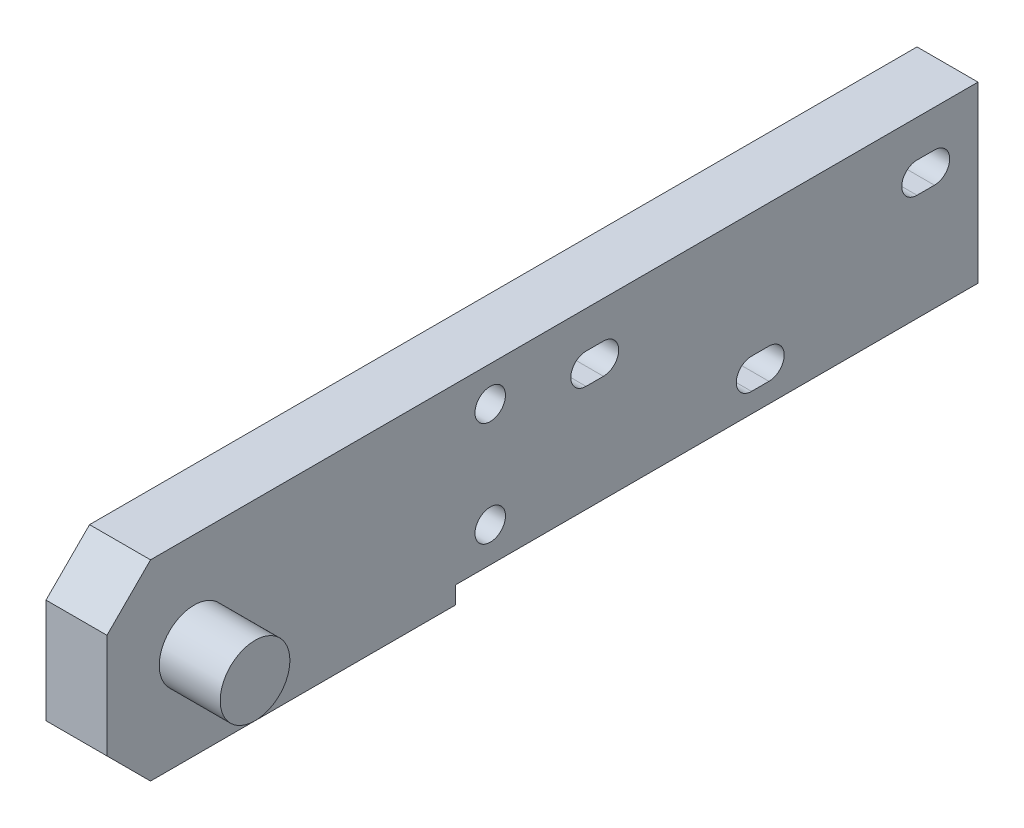
ISO-10303-21;
HEADER;
FILE_DESCRIPTION(('STEP AP214'),'2;1');
FILE_NAME('part.step','',(''),(''),'','','');
FILE_SCHEMA(('AUTOMOTIVE_DESIGN { 1 0 10303 214 1 1 1 1 }'));
ENDSEC;
DATA;
#1=APPLICATION_CONTEXT('core data for automotive mechanical design processes');
#2=APPLICATION_PROTOCOL_DEFINITION('international standard','automotive_design',2000,#1);
#3=PRODUCT_CONTEXT('',#1,'mechanical');
#4=PRODUCT('Part','Part','',(#3));
#5=PRODUCT_RELATED_PRODUCT_CATEGORY('part','',(#4));
#6=PRODUCT_DEFINITION_FORMATION('','',#4);
#7=PRODUCT_DEFINITION_CONTEXT('part definition',#1,'design');
#8=PRODUCT_DEFINITION('design','',#6,#7);
#9=PRODUCT_DEFINITION_SHAPE('','',#8);
#10=(LENGTH_UNIT() NAMED_UNIT(*) SI_UNIT(.MILLI.,.METRE.));
#11=(NAMED_UNIT(*) PLANE_ANGLE_UNIT() SI_UNIT($,.RADIAN.));
#12=(NAMED_UNIT(*) SI_UNIT($,.STERADIAN.) SOLID_ANGLE_UNIT());
#13=UNCERTAINTY_MEASURE_WITH_UNIT(LENGTH_MEASURE(1.E-05),#10,'distance_accuracy_value','');
#14=(GEOMETRIC_REPRESENTATION_CONTEXT(3) GLOBAL_UNCERTAINTY_ASSIGNED_CONTEXT((#13)) GLOBAL_UNIT_ASSIGNED_CONTEXT((#10,
#11,#12)) REPRESENTATION_CONTEXT('',''));
#15=CARTESIAN_POINT('',(0.,0.,0.));
#16=DIRECTION('',(0.,0.,1.));
#17=DIRECTION('',(1.,0.,0.));
#18=AXIS2_PLACEMENT_3D('',#15,#16,#17);
#19=CARTESIAN_POINT('',(7.,0.,10.));
#20=DIRECTION('',(0.,0.,-1.));
#21=DIRECTION('',(0.,1.,0.));
#22=AXIS2_PLACEMENT_3D('',#19,#20,#21);
#23=PLANE('',#22);
#24=DIRECTION('',(0.,-1.,0.));
#25=VECTOR('',#24,1.);
#26=CARTESIAN_POINT('',(0.,0.,10.));
#27=LINE('',#26,#25);
#28=CARTESIAN_POINT('',(0.,6.,10.));
#29=VERTEX_POINT('',#28);
#30=CARTESIAN_POINT('',(0.,-6.,10.));
#31=VERTEX_POINT('',#30);
#32=EDGE_CURVE('E253',#29,#31,#27,.T.);
#33=ORIENTED_EDGE('',*,*,#32,.T.);
#34=DIRECTION('',(-1.,0.,0.));
#35=VECTOR('',#34,1.);
#36=CARTESIAN_POINT('',(7.,-6.,10.));
#37=LINE('',#36,#35);
#38=CARTESIAN_POINT('',(7.,-6.,10.));
#39=VERTEX_POINT('',#38);
#40=EDGE_CURVE('E11',#39,#31,#37,.T.);
#41=ORIENTED_EDGE('',*,*,#40,.F.);
#42=DIRECTION('',(0.,-1.,0.));
#43=VECTOR('',#42,1.);
#44=CARTESIAN_POINT('',(7.,0.,10.));
#45=LINE('',#44,#43);
#46=CARTESIAN_POINT('',(7.,6.,10.));
#47=VERTEX_POINT('',#46);
#48=EDGE_CURVE('E353',#47,#39,#45,.T.);
#49=ORIENTED_EDGE('',*,*,#48,.F.);
#50=DIRECTION('',(-1.,0.,0.));
#51=VECTOR('',#50,1.);
#52=CARTESIAN_POINT('',(7.,6.,10.));
#53=LINE('',#52,#51);
#54=EDGE_CURVE('E271',#47,#29,#53,.T.);
#55=ORIENTED_EDGE('',*,*,#54,.T.);
#56=EDGE_LOOP('',(#33,#41,#49,#55));
#57=FACE_BOUND('',#56,.T.);
#58=ADVANCED_FACE('F40',(#57),#23,.F.);
#59=CARTESIAN_POINT('',(7.,-8.,8.));
#60=DIRECTION('',(0.,0.707106781186547,-0.707106781186548));
#61=DIRECTION('',(0.,0.707106781186548,0.707106781186547));
#62=AXIS2_PLACEMENT_3D('',#59,#60,#61);
#63=PLANE('',#62);
#64=DIRECTION('',(0.,-0.707106781186548,-0.707106781186547));
#65=VECTOR('',#64,1.);
#66=CARTESIAN_POINT('',(0.,-8.,8.));
#67=LINE('',#66,#65);
#68=CARTESIAN_POINT('',(0.,-11.,5.));
#69=VERTEX_POINT('',#68);
#70=EDGE_CURVE('E256',#31,#69,#67,.T.);
#71=ORIENTED_EDGE('',*,*,#70,.T.);
#72=DIRECTION('',(-1.,0.,0.));
#73=VECTOR('',#72,1.);
#74=CARTESIAN_POINT('',(7.,-11.,5.));
#75=LINE('',#74,#73);
#76=CARTESIAN_POINT('',(7.,-11.,5.));
#77=VERTEX_POINT('',#76);
#78=EDGE_CURVE('E50',#77,#69,#75,.T.);
#79=ORIENTED_EDGE('',*,*,#78,.F.);
#80=DIRECTION('',(0.,-0.707106781186548,-0.707106781186547));
#81=VECTOR('',#80,1.);
#82=CARTESIAN_POINT('',(7.,-8.,8.));
#83=LINE('',#82,#81);
#84=EDGE_CURVE('E355',#39,#77,#83,.T.);
#85=ORIENTED_EDGE('',*,*,#84,.F.);
#86=ORIENTED_EDGE('',*,*,#40,.T.);
#87=EDGE_LOOP('',(#71,#79,#85,#86));
#88=FACE_BOUND('',#87,.T.);
#89=ADVANCED_FACE('F386',(#88),#63,.F.);
#90=CARTESIAN_POINT('',(7.,-11.,0.));
#91=DIRECTION('',(0.,1.,0.));
#92=DIRECTION('',(0.,0.,1.));
#93=AXIS2_PLACEMENT_3D('',#90,#91,#92);
#94=PLANE('',#93);
#95=DIRECTION('',(0.,0.,-1.));
#96=VECTOR('',#95,1.);
#97=CARTESIAN_POINT('',(0.,-11.,0.));
#98=LINE('',#97,#96);
#99=CARTESIAN_POINT('',(0.,-11.,-30.));
#100=VERTEX_POINT('',#99);
#101=EDGE_CURVE('E258',#69,#100,#98,.T.);
#102=ORIENTED_EDGE('',*,*,#101,.T.);
#103=DIRECTION('',(-1.,0.,0.));
#104=VECTOR('',#103,1.);
#105=CARTESIAN_POINT('',(7.,-11.,-30.));
#106=LINE('',#105,#104);
#107=CARTESIAN_POINT('',(7.,-11.,-30.));
#108=VERTEX_POINT('',#107);
#109=EDGE_CURVE('E278',#108,#100,#106,.T.);
#110=ORIENTED_EDGE('',*,*,#109,.F.);
#111=DIRECTION('',(0.,0.,-1.));
#112=VECTOR('',#111,1.);
#113=CARTESIAN_POINT('',(7.,-11.,0.));
#114=LINE('',#113,#112);
#115=EDGE_CURVE('E357',#77,#108,#114,.T.);
#116=ORIENTED_EDGE('',*,*,#115,.F.);
#117=ORIENTED_EDGE('',*,*,#78,.T.);
#118=EDGE_LOOP('',(#102,#110,#116,#117));
#119=FACE_BOUND('',#118,.T.);
#120=ADVANCED_FACE('F391',(#119),#94,.F.);
#121=CARTESIAN_POINT('',(7.,0.,-30.));
#122=DIRECTION('',(0.,0.,1.));
#123=DIRECTION('',(1.,0.,0.));
#124=AXIS2_PLACEMENT_3D('',#121,#122,#123);
#125=PLANE('',#124);
#126=DIRECTION('',(0.,1.,0.));
#127=VECTOR('',#126,1.);
#128=CARTESIAN_POINT('',(0.,0.,-30.));
#129=LINE('',#128,#127);
#130=CARTESIAN_POINT('',(0.,-9.00000000000001,-30.));
#131=VERTEX_POINT('',#130);
#132=EDGE_CURVE('E260',#100,#131,#129,.T.);
#133=ORIENTED_EDGE('',*,*,#132,.T.);
#134=DIRECTION('',(-1.,0.,0.));
#135=VECTOR('',#134,1.);
#136=CARTESIAN_POINT('',(7.,-9.00000000000001,-30.));
#137=LINE('',#136,#135);
#138=CARTESIAN_POINT('',(7.,-9.00000000000001,-30.));
#139=VERTEX_POINT('',#138);
#140=EDGE_CURVE('E276',#139,#131,#137,.T.);
#141=ORIENTED_EDGE('',*,*,#140,.F.);
#142=DIRECTION('',(0.,1.,0.));
#143=VECTOR('',#142,1.);
#144=CARTESIAN_POINT('',(7.,0.,-30.));
#145=LINE('',#144,#143);
#146=EDGE_CURVE('E359',#108,#139,#145,.T.);
#147=ORIENTED_EDGE('',*,*,#146,.F.);
#148=ORIENTED_EDGE('',*,*,#109,.T.);
#149=EDGE_LOOP('',(#133,#141,#147,#148));
#150=FACE_BOUND('',#149,.T.);
#151=ADVANCED_FACE('F601',(#150),#125,.F.);
#152=CARTESIAN_POINT('',(7.,-9.00000000000001,0.));
#153=DIRECTION('',(0.,-1.,0.));
#154=DIRECTION('',(0.,0.,-1.));
#155=AXIS2_PLACEMENT_3D('',#152,#153,#154);
#156=PLANE('',#155);
#157=DIRECTION('',(0.,0.,1.));
#158=VECTOR('',#157,1.);
#159=CARTESIAN_POINT('',(0.,-9.00000000000001,0.));
#160=LINE('',#159,#158);
#161=CARTESIAN_POINT('',(0.,-9.,-90.));
#162=VERTEX_POINT('',#161);
#163=EDGE_CURVE('E263',#162,#131,#160,.T.);
#164=ORIENTED_EDGE('',*,*,#163,.F.);
#165=DIRECTION('',(-1.,0.,0.));
#166=VECTOR('',#165,1.);
#167=CARTESIAN_POINT('',(7.,-9.,-90.));
#168=LINE('',#167,#166);
#169=CARTESIAN_POINT('',(7.,-9.,-90.));
#170=VERTEX_POINT('',#169);
#171=EDGE_CURVE('E196',#170,#162,#168,.T.);
#172=ORIENTED_EDGE('',*,*,#171,.F.);
#173=DIRECTION('',(0.,0.,1.));
#174=VECTOR('',#173,1.);
#175=CARTESIAN_POINT('',(7.,-9.00000000000001,0.));
#176=LINE('',#175,#174);
#177=EDGE_CURVE('E202',#170,#139,#176,.T.);
#178=ORIENTED_EDGE('',*,*,#177,.T.);
#179=ORIENTED_EDGE('',*,*,#140,.T.);
#180=EDGE_LOOP('',(#164,#172,#178,#179));
#181=FACE_BOUND('',#180,.T.);
#182=ADVANCED_FACE('F362',(#181),#156,.T.);
#183=CARTESIAN_POINT('',(7.,0.,-90.));
#184=DIRECTION('',(0.,0.,-1.));
#185=DIRECTION('',(-1.,0.,0.));
#186=AXIS2_PLACEMENT_3D('',#183,#184,#185);
#187=PLANE('',#186);
#188=DIRECTION('',(0.,-1.,0.));
#189=VECTOR('',#188,1.);
#190=CARTESIAN_POINT('',(0.,0.,-90.));
#191=LINE('',#190,#189);
#192=CARTESIAN_POINT('',(0.,11.,-90.));
#193=VERTEX_POINT('',#192);
#194=EDGE_CURVE('E191',#193,#162,#191,.T.);
#195=ORIENTED_EDGE('',*,*,#194,.F.);
#196=DIRECTION('',(-1.,0.,0.));
#197=VECTOR('',#196,1.);
#198=CARTESIAN_POINT('',(7.,11.,-90.));
#199=LINE('',#198,#197);
#200=CARTESIAN_POINT('',(7.,11.,-90.));
#201=VERTEX_POINT('',#200);
#202=EDGE_CURVE('E186',#201,#193,#199,.T.);
#203=ORIENTED_EDGE('',*,*,#202,.F.);
#204=DIRECTION('',(0.,-1.,0.));
#205=VECTOR('',#204,1.);
#206=CARTESIAN_POINT('',(7.,0.,-90.));
#207=LINE('',#206,#205);
#208=EDGE_CURVE('E189',#201,#170,#207,.T.);
#209=ORIENTED_EDGE('',*,*,#208,.T.);
#210=ORIENTED_EDGE('',*,*,#171,.T.);
#211=EDGE_LOOP('',(#195,#203,#209,#210));
#212=FACE_BOUND('',#211,.T.);
#213=ADVANCED_FACE('F188',(#212),#187,.T.);
#214=CARTESIAN_POINT('',(7.,11.,0.));
#215=DIRECTION('',(0.,1.,0.));
#216=DIRECTION('',(0.,0.,1.));
#217=AXIS2_PLACEMENT_3D('',#214,#215,#216);
#218=PLANE('',#217);
#219=DIRECTION('',(0.,0.,-1.));
#220=VECTOR('',#219,1.);
#221=CARTESIAN_POINT('',(0.,11.,0.));
#222=LINE('',#221,#220);
#223=CARTESIAN_POINT('',(0.,11.,5.));
#224=VERTEX_POINT('',#223);
#225=EDGE_CURVE('E267',#224,#193,#222,.T.);
#226=ORIENTED_EDGE('',*,*,#225,.F.);
#227=DIRECTION('',(-1.,0.,0.));
#228=VECTOR('',#227,1.);
#229=CARTESIAN_POINT('',(7.,11.,5.));
#230=LINE('',#229,#228);
#231=CARTESIAN_POINT('',(7.,11.,5.));
#232=VERTEX_POINT('',#231);
#233=EDGE_CURVE('E123',#232,#224,#230,.T.);
#234=ORIENTED_EDGE('',*,*,#233,.F.);
#235=DIRECTION('',(0.,0.,-1.));
#236=VECTOR('',#235,1.);
#237=CARTESIAN_POINT('',(7.,11.,0.));
#238=LINE('',#237,#236);
#239=EDGE_CURVE('E200',#232,#201,#238,.T.);
#240=ORIENTED_EDGE('',*,*,#239,.T.);
#241=ORIENTED_EDGE('',*,*,#202,.T.);
#242=EDGE_LOOP('',(#226,#234,#240,#241));
#243=FACE_BOUND('',#242,.T.);
#244=ADVANCED_FACE('F204',(#243),#218,.T.);
#245=CARTESIAN_POINT('',(7.,5.00000000000001,-47.));
#246=DIRECTION('',(-1.,0.,0.));
#247=DIRECTION('',(0.,0.,1.));
#248=AXIS2_PLACEMENT_3D('',#245,#246,#247);
#249=CYLINDRICAL_SURFACE('',#248,1.75);
#250=CARTESIAN_POINT('',(0.,5.00000000000001,-47.));
#251=DIRECTION('',(1.,0.,0.));
#252=DIRECTION('',(0.,0.,-1.));
#253=AXIS2_PLACEMENT_3D('',#250,#251,#252);
#254=CIRCLE('',#253,1.75);
#255=CARTESIAN_POINT('',(0.,3.25000000000001,-47.));
#256=VERTEX_POINT('',#255);
#257=CARTESIAN_POINT('',(0.,6.75000000000001,-47.));
#258=VERTEX_POINT('',#257);
#259=EDGE_CURVE('E241',#256,#258,#254,.T.);
#260=ORIENTED_EDGE('',*,*,#259,.F.);
#261=DIRECTION('',(-1.,0.,0.));
#262=VECTOR('',#261,1.);
#263=CARTESIAN_POINT('',(7.,3.25000000000001,-47.));
#264=LINE('',#263,#262);
#265=CARTESIAN_POINT('',(7.,3.25000000000001,-47.));
#266=VERTEX_POINT('',#265);
#267=EDGE_CURVE('E273',#266,#256,#264,.T.);
#268=ORIENTED_EDGE('',*,*,#267,.F.);
#269=CARTESIAN_POINT('',(7.,5.00000000000001,-47.));
#270=DIRECTION('',(1.,0.,0.));
#271=DIRECTION('',(0.,0.,-1.));
#272=AXIS2_PLACEMENT_3D('',#269,#270,#271);
#273=CIRCLE('',#272,1.75);
#274=CARTESIAN_POINT('',(7.,6.75000000000001,-47.));
#275=VERTEX_POINT('',#274);
#276=EDGE_CURVE('E342',#266,#275,#273,.T.);
#277=ORIENTED_EDGE('',*,*,#276,.T.);
#278=DIRECTION('',(-1.,0.,0.));
#279=VECTOR('',#278,1.);
#280=CARTESIAN_POINT('',(7.,6.75000000000001,-47.));
#281=LINE('',#280,#279);
#282=EDGE_CURVE('E283',#275,#258,#281,.T.);
#283=ORIENTED_EDGE('',*,*,#282,.T.);
#284=EDGE_LOOP('',(#260,#268,#277,#283));
#285=FACE_BOUND('',#284,.T.);
#286=ADVANCED_FACE('F409',(#285),#249,.F.);
#287=CARTESIAN_POINT('',(7.,3.25,0.));
#288=DIRECTION('',(0.,1.,0.));
#289=DIRECTION('',(0.,0.,1.));
#290=AXIS2_PLACEMENT_3D('',#287,#288,#289);
#291=PLANE('',#290);
#292=DIRECTION('',(0.,0.,-1.));
#293=VECTOR('',#292,1.);
#294=CARTESIAN_POINT('',(0.,3.25,0.));
#295=LINE('',#294,#293);
#296=CARTESIAN_POINT('',(0.,3.25000000000001,-45.));
#297=VERTEX_POINT('',#296);
#298=EDGE_CURVE('E244',#297,#256,#295,.T.);
#299=ORIENTED_EDGE('',*,*,#298,.F.);
#300=DIRECTION('',(-1.,0.,0.));
#301=VECTOR('',#300,1.);
#302=CARTESIAN_POINT('',(7.,3.25000000000001,-45.));
#303=LINE('',#302,#301);
#304=CARTESIAN_POINT('',(7.,3.25000000000001,-45.));
#305=VERTEX_POINT('',#304);
#306=EDGE_CURVE('E288',#305,#297,#303,.T.);
#307=ORIENTED_EDGE('',*,*,#306,.F.);
#308=DIRECTION('',(0.,0.,-1.));
#309=VECTOR('',#308,1.);
#310=CARTESIAN_POINT('',(7.,3.25,0.));
#311=LINE('',#310,#309);
#312=EDGE_CURVE('E345',#305,#266,#311,.T.);
#313=ORIENTED_EDGE('',*,*,#312,.T.);
#314=ORIENTED_EDGE('',*,*,#267,.T.);
#315=EDGE_LOOP('',(#299,#307,#313,#314));
#316=FACE_BOUND('',#315,.T.);
#317=ADVANCED_FACE('F405',(#316),#291,.T.);
#318=CARTESIAN_POINT('',(7.,5.00000000000001,-45.));
#319=DIRECTION('',(-1.,0.,0.));
#320=DIRECTION('',(0.,0.,1.));
#321=AXIS2_PLACEMENT_3D('',#318,#319,#320);
#322=CYLINDRICAL_SURFACE('',#321,1.75);
#323=CARTESIAN_POINT('',(0.,5.00000000000001,-45.));
#324=DIRECTION('',(1.,0.,0.));
#325=DIRECTION('',(0.,0.,-1.));
#326=AXIS2_PLACEMENT_3D('',#323,#324,#325);
#327=CIRCLE('',#326,1.75);
#328=CARTESIAN_POINT('',(0.,6.75000000000001,-45.));
#329=VERTEX_POINT('',#328);
#330=EDGE_CURVE('E247',#329,#297,#327,.T.);
#331=ORIENTED_EDGE('',*,*,#330,.F.);
#332=DIRECTION('',(-1.,0.,0.));
#333=VECTOR('',#332,1.);
#334=CARTESIAN_POINT('',(7.,6.75000000000001,-45.));
#335=LINE('',#334,#333);
#336=CARTESIAN_POINT('',(7.,6.75000000000001,-45.));
#337=VERTEX_POINT('',#336);
#338=EDGE_CURVE('E285',#337,#329,#335,.T.);
#339=ORIENTED_EDGE('',*,*,#338,.F.);
#340=CARTESIAN_POINT('',(7.,5.00000000000001,-45.));
#341=DIRECTION('',(1.,0.,0.));
#342=DIRECTION('',(0.,0.,-1.));
#343=AXIS2_PLACEMENT_3D('',#340,#341,#342);
#344=CIRCLE('',#343,1.75);
#345=EDGE_CURVE('E348',#337,#305,#344,.T.);
#346=ORIENTED_EDGE('',*,*,#345,.T.);
#347=ORIENTED_EDGE('',*,*,#306,.T.);
#348=EDGE_LOOP('',(#331,#339,#346,#347));
#349=FACE_BOUND('',#348,.T.);
#350=ADVANCED_FACE('F401',(#349),#322,.F.);
#351=CARTESIAN_POINT('',(7.,-5.,-66.));
#352=DIRECTION('',(-1.,0.,0.));
#353=DIRECTION('',(0.,0.,1.));
#354=AXIS2_PLACEMENT_3D('',#351,#352,#353);
#355=CYLINDRICAL_SURFACE('',#354,1.75);
#356=CARTESIAN_POINT('',(0.,-5.,-66.));
#357=DIRECTION('',(1.,0.,0.));
#358=DIRECTION('',(0.,0.,-1.));
#359=AXIS2_PLACEMENT_3D('',#356,#357,#358);
#360=CIRCLE('',#359,1.75);
#361=CARTESIAN_POINT('',(0.,-6.75,-66.));
#362=VERTEX_POINT('',#361);
#363=CARTESIAN_POINT('',(0.,-3.25,-66.));
#364=VERTEX_POINT('',#363);
#365=EDGE_CURVE('E229',#362,#364,#360,.T.);
#366=ORIENTED_EDGE('',*,*,#365,.F.);
#367=DIRECTION('',(-1.,0.,0.));
#368=VECTOR('',#367,1.);
#369=CARTESIAN_POINT('',(7.,-6.75,-66.));
#370=LINE('',#369,#368);
#371=CARTESIAN_POINT('',(7.,-6.75,-66.));
#372=VERTEX_POINT('',#371);
#373=EDGE_CURVE('E286',#372,#362,#370,.T.);
#374=ORIENTED_EDGE('',*,*,#373,.F.);
#375=CARTESIAN_POINT('',(7.,-5.,-66.));
#376=DIRECTION('',(1.,0.,0.));
#377=DIRECTION('',(0.,0.,-1.));
#378=AXIS2_PLACEMENT_3D('',#375,#376,#377);
#379=CIRCLE('',#378,1.75);
#380=CARTESIAN_POINT('',(7.,-3.25,-66.));
#381=VERTEX_POINT('',#380);
#382=EDGE_CURVE('E324',#372,#381,#379,.T.);
#383=ORIENTED_EDGE('',*,*,#382,.T.);
#384=DIRECTION('',(-1.,0.,0.));
#385=VECTOR('',#384,1.);
#386=CARTESIAN_POINT('',(7.,-3.25,-66.));
#387=LINE('',#386,#385);
#388=EDGE_CURVE('E291',#381,#364,#387,.T.);
#389=ORIENTED_EDGE('',*,*,#388,.T.);
#390=EDGE_LOOP('',(#366,#374,#383,#389));
#391=FACE_BOUND('',#390,.T.);
#392=ADVANCED_FACE('F404',(#391),#355,.F.);
#393=CARTESIAN_POINT('',(7.,-6.75,0.));
#394=DIRECTION('',(0.,1.,0.));
#395=DIRECTION('',(0.,0.,1.));
#396=AXIS2_PLACEMENT_3D('',#393,#394,#395);
#397=PLANE('',#396);
#398=DIRECTION('',(0.,0.,-1.));
#399=VECTOR('',#398,1.);
#400=CARTESIAN_POINT('',(0.,-6.75,0.));
#401=LINE('',#400,#399);
#402=CARTESIAN_POINT('',(0.,-6.75,-64.));
#403=VERTEX_POINT('',#402);
#404=EDGE_CURVE('E232',#403,#362,#401,.T.);
#405=ORIENTED_EDGE('',*,*,#404,.F.);
#406=DIRECTION('',(-1.,0.,0.));
#407=VECTOR('',#406,1.);
#408=CARTESIAN_POINT('',(7.,-6.75,-64.));
#409=LINE('',#408,#407);
#410=CARTESIAN_POINT('',(7.,-6.75,-64.));
#411=VERTEX_POINT('',#410);
#412=EDGE_CURVE('E295',#411,#403,#409,.T.);
#413=ORIENTED_EDGE('',*,*,#412,.F.);
#414=DIRECTION('',(0.,0.,-1.));
#415=VECTOR('',#414,1.);
#416=CARTESIAN_POINT('',(7.,-6.75,0.));
#417=LINE('',#416,#415);
#418=EDGE_CURVE('E334',#411,#372,#417,.T.);
#419=ORIENTED_EDGE('',*,*,#418,.T.);
#420=ORIENTED_EDGE('',*,*,#373,.T.);
#421=EDGE_LOOP('',(#405,#413,#419,#420));
#422=FACE_BOUND('',#421,.T.);
#423=ADVANCED_FACE('F420',(#422),#397,.T.);
#424=CARTESIAN_POINT('',(7.,-5.,-64.));
#425=DIRECTION('',(-1.,0.,0.));
#426=DIRECTION('',(0.,0.,1.));
#427=AXIS2_PLACEMENT_3D('',#424,#425,#426);
#428=CYLINDRICAL_SURFACE('',#427,1.75);
#429=CARTESIAN_POINT('',(0.,-5.,-64.));
#430=DIRECTION('',(1.,0.,0.));
#431=DIRECTION('',(0.,0.,-1.));
#432=AXIS2_PLACEMENT_3D('',#429,#430,#431);
#433=CIRCLE('',#432,1.75);
#434=CARTESIAN_POINT('',(0.,-3.25,-64.));
#435=VERTEX_POINT('',#434);
#436=EDGE_CURVE('E235',#435,#403,#433,.T.);
#437=ORIENTED_EDGE('',*,*,#436,.F.);
#438=DIRECTION('',(-1.,0.,0.));
#439=VECTOR('',#438,1.);
#440=CARTESIAN_POINT('',(7.,-3.25,-64.));
#441=LINE('',#440,#439);
#442=CARTESIAN_POINT('',(7.,-3.25,-64.));
#443=VERTEX_POINT('',#442);
#444=EDGE_CURVE('E293',#443,#435,#441,.T.);
#445=ORIENTED_EDGE('',*,*,#444,.F.);
#446=CARTESIAN_POINT('',(7.,-5.,-64.));
#447=DIRECTION('',(1.,0.,0.));
#448=DIRECTION('',(0.,0.,-1.));
#449=AXIS2_PLACEMENT_3D('',#446,#447,#448);
#450=CIRCLE('',#449,1.75);
#451=EDGE_CURVE('E337',#443,#411,#450,.T.);
#452=ORIENTED_EDGE('',*,*,#451,.T.);
#453=ORIENTED_EDGE('',*,*,#412,.T.);
#454=EDGE_LOOP('',(#437,#445,#452,#453));
#455=FACE_BOUND('',#454,.T.);
#456=ADVANCED_FACE('F417',(#455),#428,.F.);
#457=CARTESIAN_POINT('',(7.,5.00000000000001,-83.));
#458=DIRECTION('',(-1.,0.,0.));
#459=DIRECTION('',(0.,0.,1.));
#460=AXIS2_PLACEMENT_3D('',#457,#458,#459);
#461=CYLINDRICAL_SURFACE('',#460,1.75);
#462=CARTESIAN_POINT('',(0.,5.00000000000001,-83.));
#463=DIRECTION('',(1.,0.,0.));
#464=DIRECTION('',(0.,0.,-1.));
#465=AXIS2_PLACEMENT_3D('',#462,#463,#464);
#466=CIRCLE('',#465,1.75);
#467=CARTESIAN_POINT('',(0.,6.75000000000001,-83.));
#468=VERTEX_POINT('',#467);
#469=CARTESIAN_POINT('',(0.,3.25000000000001,-83.));
#470=VERTEX_POINT('',#469);
#471=EDGE_CURVE('E217',#468,#470,#466,.T.);
#472=ORIENTED_EDGE('',*,*,#471,.F.);
#473=DIRECTION('',(-1.,0.,0.));
#474=VECTOR('',#473,1.);
#475=CARTESIAN_POINT('',(7.,6.75000000000001,-83.));
#476=LINE('',#475,#474);
#477=CARTESIAN_POINT('',(7.,6.75000000000001,-83.));
#478=VERTEX_POINT('',#477);
#479=EDGE_CURVE('E44',#478,#468,#476,.T.);
#480=ORIENTED_EDGE('',*,*,#479,.F.);
#481=CARTESIAN_POINT('',(7.,5.00000000000001,-83.));
#482=DIRECTION('',(1.,0.,0.));
#483=DIRECTION('',(0.,0.,-1.));
#484=AXIS2_PLACEMENT_3D('',#481,#482,#483);
#485=CIRCLE('',#484,1.75);
#486=CARTESIAN_POINT('',(7.,3.25000000000001,-83.));
#487=VERTEX_POINT('',#486);
#488=EDGE_CURVE('E328',#478,#487,#485,.T.);
#489=ORIENTED_EDGE('',*,*,#488,.T.);
#490=DIRECTION('',(-1.,0.,0.));
#491=VECTOR('',#490,1.);
#492=CARTESIAN_POINT('',(7.,3.25000000000001,-83.));
#493=LINE('',#492,#491);
#494=EDGE_CURVE('E206',#487,#470,#493,.T.);
#495=ORIENTED_EDGE('',*,*,#494,.T.);
#496=EDGE_LOOP('',(#472,#480,#489,#495));
#497=FACE_BOUND('',#496,.T.);
#498=ADVANCED_FACE('F310',(#497),#461,.F.);
#499=CARTESIAN_POINT('',(7.,6.74999999999998,0.));
#500=DIRECTION('',(0.,-1.,0.));
#501=DIRECTION('',(0.,0.,-1.));
#502=AXIS2_PLACEMENT_3D('',#499,#500,#501);
#503=PLANE('',#502);
#504=DIRECTION('',(0.,0.,1.));
#505=VECTOR('',#504,1.);
#506=CARTESIAN_POINT('',(0.,6.74999999999998,0.));
#507=LINE('',#506,#505);
#508=CARTESIAN_POINT('',(0.,6.75000000000002,-85.));
#509=VERTEX_POINT('',#508);
#510=EDGE_CURVE('E220',#509,#468,#507,.T.);
#511=ORIENTED_EDGE('',*,*,#510,.F.);
#512=DIRECTION('',(-1.,0.,0.));
#513=VECTOR('',#512,1.);
#514=CARTESIAN_POINT('',(7.,6.75000000000002,-85.));
#515=LINE('',#514,#513);
#516=CARTESIAN_POINT('',(7.,6.75000000000002,-85.));
#517=VERTEX_POINT('',#516);
#518=EDGE_CURVE('E300',#517,#509,#515,.T.);
#519=ORIENTED_EDGE('',*,*,#518,.F.);
#520=DIRECTION('',(0.,0.,1.));
#521=VECTOR('',#520,1.);
#522=CARTESIAN_POINT('',(7.,6.74999999999998,0.));
#523=LINE('',#522,#521);
#524=EDGE_CURVE('E309',#517,#478,#523,.T.);
#525=ORIENTED_EDGE('',*,*,#524,.T.);
#526=ORIENTED_EDGE('',*,*,#479,.T.);
#527=EDGE_LOOP('',(#511,#519,#525,#526));
#528=FACE_BOUND('',#527,.T.);
#529=ADVANCED_FACE('F307',(#528),#503,.T.);
#530=CARTESIAN_POINT('',(7.,5.00000000000001,-85.));
#531=DIRECTION('',(-1.,0.,0.));
#532=DIRECTION('',(0.,0.,1.));
#533=AXIS2_PLACEMENT_3D('',#530,#531,#532);
#534=CYLINDRICAL_SURFACE('',#533,1.75);
#535=CARTESIAN_POINT('',(0.,5.00000000000001,-85.));
#536=DIRECTION('',(1.,0.,0.));
#537=DIRECTION('',(0.,0.,-1.));
#538=AXIS2_PLACEMENT_3D('',#535,#536,#537);
#539=CIRCLE('',#538,1.75);
#540=CARTESIAN_POINT('',(0.,3.25000000000001,-85.));
#541=VERTEX_POINT('',#540);
#542=EDGE_CURVE('E223',#541,#509,#539,.T.);
#543=ORIENTED_EDGE('',*,*,#542,.F.);
#544=DIRECTION('',(-1.,0.,0.));
#545=VECTOR('',#544,1.);
#546=CARTESIAN_POINT('',(7.,3.25000000000001,-85.));
#547=LINE('',#546,#545);
#548=CARTESIAN_POINT('',(7.,3.25000000000001,-85.));
#549=VERTEX_POINT('',#548);
#550=EDGE_CURVE('E299',#549,#541,#547,.T.);
#551=ORIENTED_EDGE('',*,*,#550,.F.);
#552=CARTESIAN_POINT('',(7.,5.00000000000001,-85.));
#553=DIRECTION('',(1.,0.,0.));
#554=DIRECTION('',(0.,0.,-1.));
#555=AXIS2_PLACEMENT_3D('',#552,#553,#554);
#556=CIRCLE('',#555,1.75);
#557=EDGE_CURVE('E319',#549,#517,#556,.T.);
#558=ORIENTED_EDGE('',*,*,#557,.T.);
#559=ORIENTED_EDGE('',*,*,#518,.T.);
#560=EDGE_LOOP('',(#543,#551,#558,#559));
#561=FACE_BOUND('',#560,.T.);
#562=ADVANCED_FACE('F316',(#561),#534,.F.);
#563=CARTESIAN_POINT('',(7.,6.75000000000009,0.));
#564=DIRECTION('',(0.,1.,0.));
#565=DIRECTION('',(0.,0.,1.));
#566=AXIS2_PLACEMENT_3D('',#563,#564,#565);
#567=PLANE('',#566);
#568=DIRECTION('',(0.,0.,-1.));
#569=VECTOR('',#568,1.);
#570=CARTESIAN_POINT('',(0.,6.75000000000009,0.));
#571=LINE('',#570,#569);
#572=EDGE_CURVE('E250',#329,#258,#571,.T.);
#573=ORIENTED_EDGE('',*,*,#572,.T.);
#574=ORIENTED_EDGE('',*,*,#282,.F.);
#575=DIRECTION('',(0.,0.,-1.));
#576=VECTOR('',#575,1.);
#577=CARTESIAN_POINT('',(7.,6.75000000000009,0.));
#578=LINE('',#577,#576);
#579=EDGE_CURVE('E351',#337,#275,#578,.T.);
#580=ORIENTED_EDGE('',*,*,#579,.F.);
#581=ORIENTED_EDGE('',*,*,#338,.T.);
#582=EDGE_LOOP('',(#573,#574,#580,#581));
#583=FACE_BOUND('',#582,.T.);
#584=ADVANCED_FACE('F396',(#583),#567,.F.);
#585=CARTESIAN_POINT('',(7.,-3.25000000000002,0.));
#586=DIRECTION('',(0.,1.,0.));
#587=DIRECTION('',(0.,0.,1.));
#588=AXIS2_PLACEMENT_3D('',#585,#586,#587);
#589=PLANE('',#588);
#590=DIRECTION('',(0.,0.,-1.));
#591=VECTOR('',#590,1.);
#592=CARTESIAN_POINT('',(0.,-3.25000000000002,0.));
#593=LINE('',#592,#591);
#594=EDGE_CURVE('E238',#435,#364,#593,.T.);
#595=ORIENTED_EDGE('',*,*,#594,.T.);
#596=ORIENTED_EDGE('',*,*,#388,.F.);
#597=DIRECTION('',(0.,0.,-1.));
#598=VECTOR('',#597,1.);
#599=CARTESIAN_POINT('',(7.,-3.25000000000002,0.));
#600=LINE('',#599,#598);
#601=EDGE_CURVE('E340',#443,#381,#600,.T.);
#602=ORIENTED_EDGE('',*,*,#601,.F.);
#603=ORIENTED_EDGE('',*,*,#444,.T.);
#604=EDGE_LOOP('',(#595,#596,#602,#603));
#605=FACE_BOUND('',#604,.T.);
#606=ADVANCED_FACE('F399',(#605),#589,.F.);
#607=CARTESIAN_POINT('',(7.,3.24999999999999,0.));
#608=DIRECTION('',(0.,-1.,0.));
#609=DIRECTION('',(0.,0.,-1.));
#610=AXIS2_PLACEMENT_3D('',#607,#608,#609);
#611=PLANE('',#610);
#612=DIRECTION('',(0.,0.,1.));
#613=VECTOR('',#612,1.);
#614=CARTESIAN_POINT('',(0.,3.24999999999999,0.));
#615=LINE('',#614,#613);
#616=EDGE_CURVE('E226',#541,#470,#615,.T.);
#617=ORIENTED_EDGE('',*,*,#616,.T.);
#618=ORIENTED_EDGE('',*,*,#494,.F.);
#619=DIRECTION('',(0.,0.,1.));
#620=VECTOR('',#619,1.);
#621=CARTESIAN_POINT('',(7.,3.24999999999999,0.));
#622=LINE('',#621,#620);
#623=EDGE_CURVE('E321',#549,#487,#622,.T.);
#624=ORIENTED_EDGE('',*,*,#623,.F.);
#625=ORIENTED_EDGE('',*,*,#550,.T.);
#626=EDGE_LOOP('',(#617,#618,#624,#625));
#627=FACE_BOUND('',#626,.T.);
#628=ADVANCED_FACE('F322',(#627),#611,.F.);
#629=CARTESIAN_POINT('',(7.,7.00000000000001,-34.));
#630=DIRECTION('',(-1.,0.,0.));
#631=DIRECTION('',(0.,0.,1.));
#632=AXIS2_PLACEMENT_3D('',#629,#630,#631);
#633=CYLINDRICAL_SURFACE('',#632,1.75);
#634=CARTESIAN_POINT('',(7.,7.00000000000001,-34.));
#635=DIRECTION('',(1.,0.,0.));
#636=DIRECTION('',(0.,0.,-1.));
#637=AXIS2_PLACEMENT_3D('',#634,#635,#636);
#638=CIRCLE('',#637,1.75);
#639=CARTESIAN_POINT('',(7.,7.00000000000001,-35.75));
#640=VERTEX_POINT('',#639);
#641=EDGE_CURVE('E442',#640,#640,#638,.T.);
#642=ORIENTED_EDGE('',*,*,#641,.T.);
#643=EDGE_LOOP('',(#642));
#644=FACE_BOUND('',#643,.T.);
#645=CARTESIAN_POINT('',(0.,7.00000000000001,-34.));
#646=DIRECTION('',(1.,0.,0.));
#647=DIRECTION('',(0.,0.,-1.));
#648=AXIS2_PLACEMENT_3D('',#645,#646,#647);
#649=CIRCLE('',#648,1.75);
#650=CARTESIAN_POINT('',(0.,7.00000000000001,-35.75));
#651=VERTEX_POINT('',#650);
#652=EDGE_CURVE('E213',#651,#651,#649,.T.);
#653=ORIENTED_EDGE('',*,*,#652,.F.);
#654=EDGE_LOOP('',(#653));
#655=FACE_BOUND('',#654,.T.);
#656=ADVANCED_FACE('F381',(#644,#655),#633,.F.);
#657=CARTESIAN_POINT('',(7.,-5.,-34.));
#658=DIRECTION('',(-1.,0.,0.));
#659=DIRECTION('',(0.,0.,1.));
#660=AXIS2_PLACEMENT_3D('',#657,#658,#659);
#661=CYLINDRICAL_SURFACE('',#660,1.75);
#662=CARTESIAN_POINT('',(7.,-5.,-34.));
#663=DIRECTION('',(1.,0.,0.));
#664=DIRECTION('',(0.,0.,-1.));
#665=AXIS2_PLACEMENT_3D('',#662,#663,#664);
#666=CIRCLE('',#665,1.75);
#667=CARTESIAN_POINT('',(7.,-5.,-35.75));
#668=VERTEX_POINT('',#667);
#669=EDGE_CURVE('E270',#668,#668,#666,.T.);
#670=ORIENTED_EDGE('',*,*,#669,.T.);
#671=EDGE_LOOP('',(#670));
#672=FACE_BOUND('',#671,.T.);
#673=CARTESIAN_POINT('',(0.,-5.,-34.));
#674=DIRECTION('',(1.,0.,0.));
#675=DIRECTION('',(0.,0.,-1.));
#676=AXIS2_PLACEMENT_3D('',#673,#674,#675);
#677=CIRCLE('',#676,1.75);
#678=CARTESIAN_POINT('',(0.,-5.,-35.75));
#679=VERTEX_POINT('',#678);
#680=EDGE_CURVE('E210',#679,#679,#677,.T.);
#681=ORIENTED_EDGE('',*,*,#680,.F.);
#682=EDGE_LOOP('',(#681));
#683=FACE_BOUND('',#682,.T.);
#684=ADVANCED_FACE('F42',(#672,#683),#661,.F.);
#685=CARTESIAN_POINT('',(7.,8.,8.00000000000001));
#686=DIRECTION('',(0.,-0.707106781186547,-0.707106781186548));
#687=DIRECTION('',(0.,0.707106781186548,-0.707106781186547));
#688=AXIS2_PLACEMENT_3D('',#685,#686,#687);
#689=PLANE('',#688);
#690=DIRECTION('',(0.,-0.707106781186548,0.707106781186547));
#691=VECTOR('',#690,1.);
#692=CARTESIAN_POINT('',(0.,8.,8.00000000000001));
#693=LINE('',#692,#691);
#694=EDGE_CURVE('E126',#224,#29,#693,.T.);
#695=ORIENTED_EDGE('',*,*,#694,.T.);
#696=ORIENTED_EDGE('',*,*,#54,.F.);
#697=DIRECTION('',(0.,-0.707106781186548,0.707106781186547));
#698=VECTOR('',#697,1.);
#699=CARTESIAN_POINT('',(7.,8.,8.00000000000001));
#700=LINE('',#699,#698);
#701=EDGE_CURVE('E59',#232,#47,#700,.T.);
#702=ORIENTED_EDGE('',*,*,#701,.F.);
#703=ORIENTED_EDGE('',*,*,#233,.T.);
#704=EDGE_LOOP('',(#695,#696,#702,#703));
#705=FACE_BOUND('',#704,.T.);
#706=ADVANCED_FACE('F371',(#705),#689,.F.);
#707=CARTESIAN_POINT('',(7.,0.,0.));
#708=DIRECTION('',(1.,0.,0.));
#709=DIRECTION('',(0.,0.,-1.));
#710=AXIS2_PLACEMENT_3D('',#707,#708,#709);
#711=PLANE('',#710);
#712=CARTESIAN_POINT('',(7.,0.,0.));
#713=DIRECTION('',(1.,0.,0.));
#714=DIRECTION('',(0.,0.,-1.));
#715=AXIS2_PLACEMENT_3D('',#712,#713,#714);
#716=CIRCLE('',#715,4.);
#717=CARTESIAN_POINT('',(7.,0.,-4.));
#718=VERTEX_POINT('',#717);
#719=EDGE_CURVE('E460',#718,#718,#716,.T.);
#720=ORIENTED_EDGE('',*,*,#719,.F.);
#721=EDGE_LOOP('',(#720));
#722=FACE_BOUND('',#721,.T.);
#723=ORIENTED_EDGE('',*,*,#669,.F.);
#724=EDGE_LOOP('',(#723));
#725=FACE_BOUND('',#724,.T.);
#726=ORIENTED_EDGE('',*,*,#641,.F.);
#727=EDGE_LOOP('',(#726));
#728=FACE_BOUND('',#727,.T.);
#729=ORIENTED_EDGE('',*,*,#488,.F.);
#730=ORIENTED_EDGE('',*,*,#524,.F.);
#731=ORIENTED_EDGE('',*,*,#557,.F.);
#732=ORIENTED_EDGE('',*,*,#623,.T.);
#733=EDGE_LOOP('',(#729,#730,#731,#732));
#734=FACE_BOUND('',#733,.T.);
#735=ORIENTED_EDGE('',*,*,#382,.F.);
#736=ORIENTED_EDGE('',*,*,#418,.F.);
#737=ORIENTED_EDGE('',*,*,#451,.F.);
#738=ORIENTED_EDGE('',*,*,#601,.T.);
#739=EDGE_LOOP('',(#735,#736,#737,#738));
#740=FACE_BOUND('',#739,.T.);
#741=ORIENTED_EDGE('',*,*,#276,.F.);
#742=ORIENTED_EDGE('',*,*,#312,.F.);
#743=ORIENTED_EDGE('',*,*,#345,.F.);
#744=ORIENTED_EDGE('',*,*,#579,.T.);
#745=EDGE_LOOP('',(#741,#742,#743,#744));
#746=FACE_BOUND('',#745,.T.);
#747=ORIENTED_EDGE('',*,*,#48,.T.);
#748=ORIENTED_EDGE('',*,*,#84,.T.);
#749=ORIENTED_EDGE('',*,*,#115,.T.);
#750=ORIENTED_EDGE('',*,*,#146,.T.);
#751=ORIENTED_EDGE('',*,*,#177,.F.);
#752=ORIENTED_EDGE('',*,*,#208,.F.);
#753=ORIENTED_EDGE('',*,*,#239,.F.);
#754=ORIENTED_EDGE('',*,*,#701,.T.);
#755=EDGE_LOOP('',(#747,#748,#749,#750,#751,#752,#753,#754));
#756=FACE_BOUND('',#755,.T.);
#757=ADVANCED_FACE('F199',(#722,#725,#728,#734,#740,#746,#756),#711,.T.);
#758=CARTESIAN_POINT('',(0.,0.,0.));
#759=DIRECTION('',(1.,0.,0.));
#760=DIRECTION('',(0.,0.,-1.));
#761=AXIS2_PLACEMENT_3D('',#758,#759,#760);
#762=PLANE('',#761);
#763=ORIENTED_EDGE('',*,*,#680,.T.);
#764=EDGE_LOOP('',(#763));
#765=FACE_BOUND('',#764,.T.);
#766=ORIENTED_EDGE('',*,*,#652,.T.);
#767=EDGE_LOOP('',(#766));
#768=FACE_BOUND('',#767,.T.);
#769=ORIENTED_EDGE('',*,*,#471,.T.);
#770=ORIENTED_EDGE('',*,*,#616,.F.);
#771=ORIENTED_EDGE('',*,*,#542,.T.);
#772=ORIENTED_EDGE('',*,*,#510,.T.);
#773=EDGE_LOOP('',(#769,#770,#771,#772));
#774=FACE_BOUND('',#773,.T.);
#775=ORIENTED_EDGE('',*,*,#365,.T.);
#776=ORIENTED_EDGE('',*,*,#594,.F.);
#777=ORIENTED_EDGE('',*,*,#436,.T.);
#778=ORIENTED_EDGE('',*,*,#404,.T.);
#779=EDGE_LOOP('',(#775,#776,#777,#778));
#780=FACE_BOUND('',#779,.T.);
#781=ORIENTED_EDGE('',*,*,#259,.T.);
#782=ORIENTED_EDGE('',*,*,#572,.F.);
#783=ORIENTED_EDGE('',*,*,#330,.T.);
#784=ORIENTED_EDGE('',*,*,#298,.T.);
#785=EDGE_LOOP('',(#781,#782,#783,#784));
#786=FACE_BOUND('',#785,.T.);
#787=ORIENTED_EDGE('',*,*,#32,.F.);
#788=ORIENTED_EDGE('',*,*,#694,.F.);
#789=ORIENTED_EDGE('',*,*,#225,.T.);
#790=ORIENTED_EDGE('',*,*,#194,.T.);
#791=ORIENTED_EDGE('',*,*,#163,.T.);
#792=ORIENTED_EDGE('',*,*,#132,.F.);
#793=ORIENTED_EDGE('',*,*,#101,.F.);
#794=ORIENTED_EDGE('',*,*,#70,.F.);
#795=EDGE_LOOP('',(#787,#788,#789,#790,#791,#792,#793,#794));
#796=FACE_BOUND('',#795,.T.);
#797=ADVANCED_FACE('F314',(#765,#768,#774,#780,#786,#796),#762,.F.);
#798=CARTESIAN_POINT('',(14.,0.,0.));
#799=DIRECTION('',(-1.,0.,0.));
#800=DIRECTION('',(0.,0.,1.));
#801=AXIS2_PLACEMENT_3D('',#798,#799,#800);
#802=CYLINDRICAL_SURFACE('',#801,4.);
#803=CARTESIAN_POINT('',(14.,0.,0.));
#804=DIRECTION('',(1.,0.,0.));
#805=DIRECTION('',(0.,0.,-1.));
#806=AXIS2_PLACEMENT_3D('',#803,#804,#805);
#807=CIRCLE('',#806,4.);
#808=CARTESIAN_POINT('',(14.,0.,-4.));
#809=VERTEX_POINT('',#808);
#810=EDGE_CURVE('E214',#809,#809,#807,.T.);
#811=ORIENTED_EDGE('',*,*,#810,.F.);
#812=EDGE_LOOP('',(#811));
#813=FACE_BOUND('',#812,.T.);
#814=ORIENTED_EDGE('',*,*,#719,.T.);
#815=EDGE_LOOP('',(#814));
#816=FACE_BOUND('',#815,.T.);
#817=ADVANCED_FACE('F445',(#813,#816),#802,.T.);
#818=CARTESIAN_POINT('',(14.,0.,0.));
#819=DIRECTION('',(1.,0.,0.));
#820=DIRECTION('',(0.,0.,-1.));
#821=AXIS2_PLACEMENT_3D('',#818,#819,#820);
#822=PLANE('',#821);
#823=ORIENTED_EDGE('',*,*,#810,.T.);
#824=EDGE_LOOP('',(#823));
#825=FACE_BOUND('',#824,.T.);
#826=ADVANCED_FACE('F450',(#825),#822,.T.);
#827=CLOSED_SHELL('',(#58,#89,#120,#151,#182,#213,#244,#286,#317,#350,#392,#423,#456,#498,#529,
#562,#584,#606,#628,#656,#684,#706,#757,#797,#817,#826));
#828=MANIFOLD_SOLID_BREP('B2',#827);
#829=ADVANCED_BREP_SHAPE_REPRESENTATION('',(#18,#828),#14);
#830=SHAPE_DEFINITION_REPRESENTATION(#9,#829);
ENDSEC;
END-ISO-10303-21;
